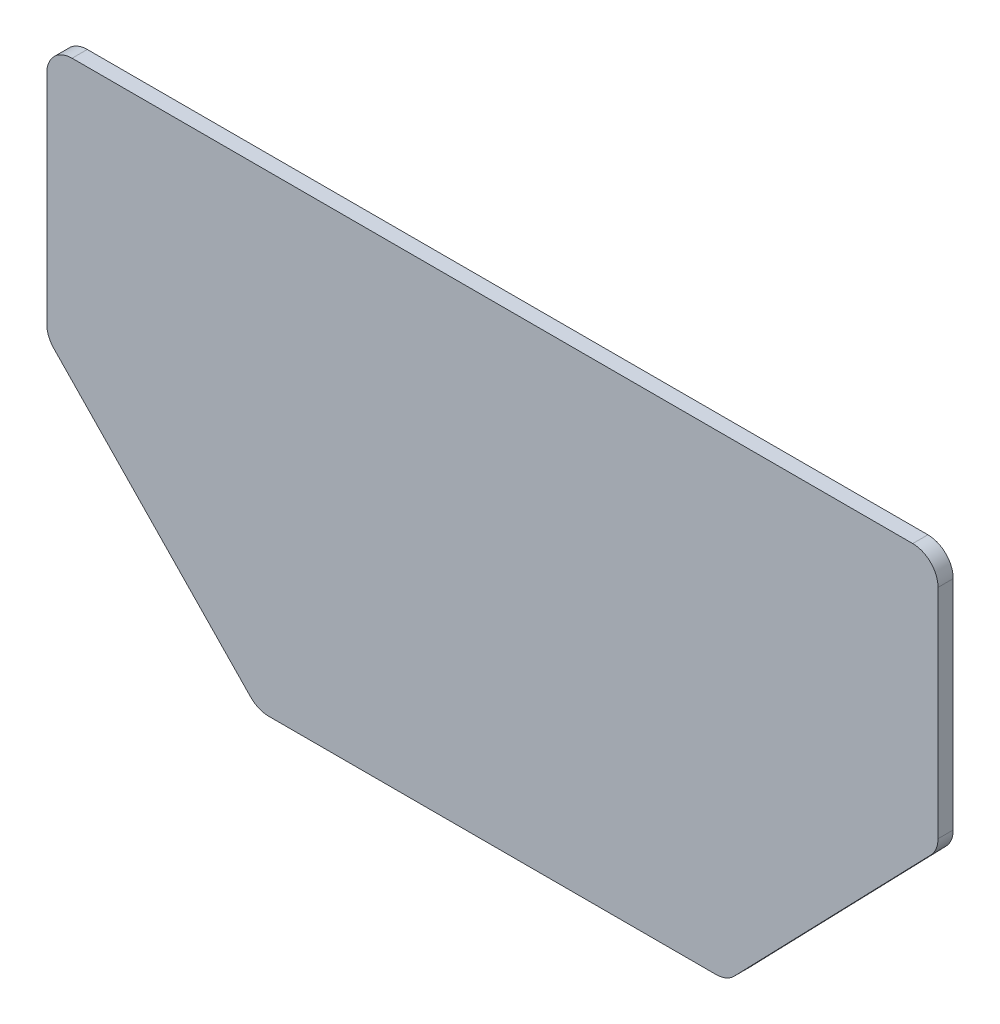
ISO-10303-21;
HEADER;
FILE_DESCRIPTION(('STEP AP214'),'2;1');
FILE_NAME('part.step','',(''),(''),'','','');
FILE_SCHEMA(('AUTOMOTIVE_DESIGN { 1 0 10303 214 1 1 1 1 }'));
ENDSEC;
DATA;
#1=APPLICATION_CONTEXT('core data for automotive mechanical design processes');
#2=APPLICATION_PROTOCOL_DEFINITION('international standard','automotive_design',2000,#1);
#3=PRODUCT_CONTEXT('',#1,'mechanical');
#4=PRODUCT('Part','Part','',(#3));
#5=PRODUCT_RELATED_PRODUCT_CATEGORY('part','',(#4));
#6=PRODUCT_DEFINITION_FORMATION('','',#4);
#7=PRODUCT_DEFINITION_CONTEXT('part definition',#1,'design');
#8=PRODUCT_DEFINITION('design','',#6,#7);
#9=PRODUCT_DEFINITION_SHAPE('','',#8);
#10=(LENGTH_UNIT() NAMED_UNIT(*) SI_UNIT(.MILLI.,.METRE.));
#11=(NAMED_UNIT(*) PLANE_ANGLE_UNIT() SI_UNIT($,.RADIAN.));
#12=(NAMED_UNIT(*) SI_UNIT($,.STERADIAN.) SOLID_ANGLE_UNIT());
#13=UNCERTAINTY_MEASURE_WITH_UNIT(LENGTH_MEASURE(1.E-05),#10,'distance_accuracy_value','');
#14=(GEOMETRIC_REPRESENTATION_CONTEXT(3) GLOBAL_UNCERTAINTY_ASSIGNED_CONTEXT((#13)) GLOBAL_UNIT_ASSIGNED_CONTEXT((#10,
#11,#12)) REPRESENTATION_CONTEXT('',''));
#15=CARTESIAN_POINT('',(0.,0.,0.));
#16=DIRECTION('',(0.,0.,1.));
#17=DIRECTION('',(1.,0.,0.));
#18=AXIS2_PLACEMENT_3D('',#15,#16,#17);
#19=CARTESIAN_POINT('',(176.,100.,6.));
#20=DIRECTION('',(0.,-1.,0.));
#21=DIRECTION('',(1.,0.,0.));
#22=AXIS2_PLACEMENT_3D('',#19,#20,#21);
#23=PLANE('',#22);
#24=DIRECTION('',(-1.,0.,0.));
#25=VECTOR('',#24,1.);
#26=CARTESIAN_POINT('',(176.,100.,6.));
#27=LINE('',#26,#25);
#28=CARTESIAN_POINT('',(166.,100.,6.));
#29=VERTEX_POINT('',#28);
#30=CARTESIAN_POINT('',(-166.,100.,6.));
#31=VERTEX_POINT('',#30);
#32=EDGE_CURVE('E172',#29,#31,#27,.T.);
#33=ORIENTED_EDGE('',*,*,#32,.F.);
#34=DIRECTION('',(0.,0.,-1.));
#35=VECTOR('',#34,1.);
#36=CARTESIAN_POINT('',(166.,100.,6.));
#37=LINE('',#36,#35);
#38=CARTESIAN_POINT('',(166.,100.,0.));
#39=VERTEX_POINT('',#38);
#40=EDGE_CURVE('E11',#29,#39,#37,.T.);
#41=ORIENTED_EDGE('',*,*,#40,.T.);
#42=DIRECTION('',(-1.,0.,0.));
#43=VECTOR('',#42,1.);
#44=CARTESIAN_POINT('',(176.,100.,0.));
#45=LINE('',#44,#43);
#46=CARTESIAN_POINT('',(-166.,100.,0.));
#47=VERTEX_POINT('',#46);
#48=EDGE_CURVE('E164',#39,#47,#45,.T.);
#49=ORIENTED_EDGE('',*,*,#48,.T.);
#50=DIRECTION('',(0.,0.,-1.));
#51=VECTOR('',#50,1.);
#52=CARTESIAN_POINT('',(-166.,100.,6.));
#53=LINE('',#52,#51);
#54=EDGE_CURVE('E49',#47,#31,#53,.F.);
#55=ORIENTED_EDGE('',*,*,#54,.T.);
#56=EDGE_LOOP('',(#33,#41,#49,#55));
#57=FACE_BOUND('',#56,.T.);
#58=ADVANCED_FACE('F41',(#57),#23,.F.);
#59=CARTESIAN_POINT('',(-176.,100.,6.));
#60=DIRECTION('',(1.,0.,0.));
#61=DIRECTION('',(0.,0.,-1.));
#62=AXIS2_PLACEMENT_3D('',#59,#60,#61);
#63=PLANE('',#62);
#64=DIRECTION('',(0.,-1.,0.));
#65=VECTOR('',#64,1.);
#66=CARTESIAN_POINT('',(-176.,100.,0.));
#67=LINE('',#66,#65);
#68=CARTESIAN_POINT('',(-176.,90.,0.));
#69=VERTEX_POINT('',#68);
#70=CARTESIAN_POINT('',(-176.,4.04512135801953,0.));
#71=VERTEX_POINT('',#70);
#72=EDGE_CURVE('E159',#69,#71,#67,.T.);
#73=ORIENTED_EDGE('',*,*,#72,.T.);
#74=DIRECTION('',(0.,0.,-1.));
#75=VECTOR('',#74,1.);
#76=CARTESIAN_POINT('',(-176.,4.04512135801953,6.));
#77=LINE('',#76,#75);
#78=CARTESIAN_POINT('',(-176.,4.04512135801953,6.));
#79=VERTEX_POINT('',#78);
#80=EDGE_CURVE('E137',#71,#79,#77,.F.);
#81=ORIENTED_EDGE('',*,*,#80,.T.);
#82=DIRECTION('',(0.,-1.,0.));
#83=VECTOR('',#82,1.);
#84=CARTESIAN_POINT('',(-176.,100.,6.));
#85=LINE('',#84,#83);
#86=CARTESIAN_POINT('',(-176.,90.,6.));
#87=VERTEX_POINT('',#86);
#88=EDGE_CURVE('E223',#87,#79,#85,.T.);
#89=ORIENTED_EDGE('',*,*,#88,.F.);
#90=DIRECTION('',(0.,0.,-1.));
#91=VECTOR('',#90,1.);
#92=CARTESIAN_POINT('',(-176.,90.,6.));
#93=LINE('',#92,#91);
#94=EDGE_CURVE('E142',#87,#69,#93,.T.);
#95=ORIENTED_EDGE('',*,*,#94,.T.);
#96=EDGE_LOOP('',(#73,#81,#89,#95));
#97=FACE_BOUND('',#96,.T.);
#98=ADVANCED_FACE('F227',(#97),#63,.F.);
#99=CARTESIAN_POINT('',(-176.,0.,6.));
#100=DIRECTION('',(0.718759299008584,0.695258994971434,0.));
#101=DIRECTION('',(-0.695258994971434,0.718759299008584,0.));
#102=AXIS2_PLACEMENT_3D('',#99,#100,#101);
#103=PLANE('',#102);
#104=DIRECTION('',(0.695258994971434,-0.718759299008584,0.));
#105=VECTOR('',#104,1.);
#106=CARTESIAN_POINT('',(-176.,0.,6.));
#107=LINE('',#106,#105);
#108=CARTESIAN_POINT('',(-173.187592990086,-2.90746859169481,6.));
#109=VERTEX_POINT('',#108);
#110=CARTESIAN_POINT('',(-95.5177729912503,-83.2025899497143,6.));
#111=VERTEX_POINT('',#110);
#112=EDGE_CURVE('E152',#109,#111,#107,.T.);
#113=ORIENTED_EDGE('',*,*,#112,.F.);
#114=DIRECTION('',(0.,0.,-1.));
#115=VECTOR('',#114,1.);
#116=CARTESIAN_POINT('',(-173.187592990086,-2.90746859169481,6.));
#117=LINE('',#116,#115);
#118=CARTESIAN_POINT('',(-173.187592990086,-2.90746859169481,0.));
#119=VERTEX_POINT('',#118);
#120=EDGE_CURVE('E136',#109,#119,#117,.T.);
#121=ORIENTED_EDGE('',*,*,#120,.T.);
#122=DIRECTION('',(0.695258994971434,-0.718759299008584,0.));
#123=VECTOR('',#122,1.);
#124=CARTESIAN_POINT('',(-176.,0.,0.));
#125=LINE('',#124,#123);
#126=CARTESIAN_POINT('',(-95.5177729912503,-83.2025899497143,0.));
#127=VERTEX_POINT('',#126);
#128=EDGE_CURVE('E149',#119,#127,#125,.T.);
#129=ORIENTED_EDGE('',*,*,#128,.T.);
#130=DIRECTION('',(0.,0.,-1.));
#131=VECTOR('',#130,1.);
#132=CARTESIAN_POINT('',(-95.5177729912503,-83.2025899497143,6.));
#133=LINE('',#132,#131);
#134=EDGE_CURVE('E154',#127,#111,#133,.F.);
#135=ORIENTED_EDGE('',*,*,#134,.T.);
#136=EDGE_LOOP('',(#113,#121,#129,#135));
#137=FACE_BOUND('',#136,.T.);
#138=ADVANCED_FACE('F148',(#137),#103,.F.);
#139=CARTESIAN_POINT('',(-92.57,-86.25,6.));
#140=DIRECTION('',(0.,1.,0.));
#141=DIRECTION('',(0.,0.,1.));
#142=AXIS2_PLACEMENT_3D('',#139,#140,#141);
#143=PLANE('',#142);
#144=DIRECTION('',(1.,0.,0.));
#145=VECTOR('',#144,1.);
#146=CARTESIAN_POINT('',(-92.57,-86.25,6.));
#147=LINE('',#146,#145);
#148=CARTESIAN_POINT('',(-88.3301800011644,-86.25,6.));
#149=VERTEX_POINT('',#148);
#150=CARTESIAN_POINT('',(88.3301800011644,-86.25,6.));
#151=VERTEX_POINT('',#150);
#152=EDGE_CURVE('E233',#149,#151,#147,.T.);
#153=ORIENTED_EDGE('',*,*,#152,.F.);
#154=DIRECTION('',(0.,0.,-1.));
#155=VECTOR('',#154,1.);
#156=CARTESIAN_POINT('',(-88.3301800011644,-86.25,6.));
#157=LINE('',#156,#155);
#158=CARTESIAN_POINT('',(-88.3301800011644,-86.25,0.));
#159=VERTEX_POINT('',#158);
#160=EDGE_CURVE('E199',#149,#159,#157,.T.);
#161=ORIENTED_EDGE('',*,*,#160,.T.);
#162=DIRECTION('',(1.,0.,0.));
#163=VECTOR('',#162,1.);
#164=CARTESIAN_POINT('',(-92.57,-86.25,0.));
#165=LINE('',#164,#163);
#166=CARTESIAN_POINT('',(88.3301800011644,-86.25,0.));
#167=VERTEX_POINT('',#166);
#168=EDGE_CURVE('E158',#159,#167,#165,.T.);
#169=ORIENTED_EDGE('',*,*,#168,.T.);
#170=DIRECTION('',(0.,0.,-1.));
#171=VECTOR('',#170,1.);
#172=CARTESIAN_POINT('',(88.3301800011644,-86.25,6.));
#173=LINE('',#172,#171);
#174=EDGE_CURVE('E197',#167,#151,#173,.F.);
#175=ORIENTED_EDGE('',*,*,#174,.T.);
#176=EDGE_LOOP('',(#153,#161,#169,#175));
#177=FACE_BOUND('',#176,.T.);
#178=ADVANCED_FACE('F243',(#177),#143,.F.);
#179=CARTESIAN_POINT('',(92.57,-86.25,6.));
#180=DIRECTION('',(-0.718759299008584,0.695258994971434,0.));
#181=DIRECTION('',(-0.695258994971434,-0.718759299008584,0.));
#182=AXIS2_PLACEMENT_3D('',#179,#180,#181);
#183=PLANE('',#182);
#184=DIRECTION('',(0.695258994971434,0.718759299008584,0.));
#185=VECTOR('',#184,1.);
#186=CARTESIAN_POINT('',(92.57,-86.25,6.));
#187=LINE('',#186,#185);
#188=CARTESIAN_POINT('',(95.5177729912503,-83.2025899497143,6.));
#189=VERTEX_POINT('',#188);
#190=CARTESIAN_POINT('',(173.187592990086,-2.90746859169483,6.));
#191=VERTEX_POINT('',#190);
#192=EDGE_CURVE('E231',#189,#191,#187,.T.);
#193=ORIENTED_EDGE('',*,*,#192,.F.);
#194=DIRECTION('',(0.,0.,-1.));
#195=VECTOR('',#194,1.);
#196=CARTESIAN_POINT('',(95.5177729912503,-83.2025899497143,6.));
#197=LINE('',#196,#195);
#198=CARTESIAN_POINT('',(95.5177729912503,-83.2025899497143,0.));
#199=VERTEX_POINT('',#198);
#200=EDGE_CURVE('E204',#189,#199,#197,.T.);
#201=ORIENTED_EDGE('',*,*,#200,.T.);
#202=DIRECTION('',(0.695258994971434,0.718759299008584,0.));
#203=VECTOR('',#202,1.);
#204=CARTESIAN_POINT('',(92.57,-86.25,0.));
#205=LINE('',#204,#203);
#206=CARTESIAN_POINT('',(173.187592990086,-2.90746859169483,0.));
#207=VERTEX_POINT('',#206);
#208=EDGE_CURVE('E162',#199,#207,#205,.T.);
#209=ORIENTED_EDGE('',*,*,#208,.T.);
#210=DIRECTION('',(0.,0.,-1.));
#211=VECTOR('',#210,1.);
#212=CARTESIAN_POINT('',(173.187592990086,-2.90746859169484,6.));
#213=LINE('',#212,#211);
#214=EDGE_CURVE('E202',#207,#191,#213,.F.);
#215=ORIENTED_EDGE('',*,*,#214,.T.);
#216=EDGE_LOOP('',(#193,#201,#209,#215));
#217=FACE_BOUND('',#216,.T.);
#218=ADVANCED_FACE('F252',(#217),#183,.F.);
#219=CARTESIAN_POINT('',(176.,0.,6.));
#220=DIRECTION('',(-1.,0.,0.));
#221=DIRECTION('',(0.,-1.,0.));
#222=AXIS2_PLACEMENT_3D('',#219,#220,#221);
#223=PLANE('',#222);
#224=DIRECTION('',(0.,1.,0.));
#225=VECTOR('',#224,1.);
#226=CARTESIAN_POINT('',(176.,0.,6.));
#227=LINE('',#226,#225);
#228=CARTESIAN_POINT('',(176.,4.04512135801952,6.));
#229=VERTEX_POINT('',#228);
#230=CARTESIAN_POINT('',(176.,90.,6.));
#231=VERTEX_POINT('',#230);
#232=EDGE_CURVE('E173',#229,#231,#227,.T.);
#233=ORIENTED_EDGE('',*,*,#232,.F.);
#234=DIRECTION('',(0.,0.,-1.));
#235=VECTOR('',#234,1.);
#236=CARTESIAN_POINT('',(176.,4.04512135801952,6.));
#237=LINE('',#236,#235);
#238=CARTESIAN_POINT('',(176.,4.04512135801952,0.));
#239=VERTEX_POINT('',#238);
#240=EDGE_CURVE('E208',#229,#239,#237,.T.);
#241=ORIENTED_EDGE('',*,*,#240,.T.);
#242=DIRECTION('',(0.,1.,0.));
#243=VECTOR('',#242,1.);
#244=CARTESIAN_POINT('',(176.,0.,0.));
#245=LINE('',#244,#243);
#246=CARTESIAN_POINT('',(176.,90.,0.));
#247=VERTEX_POINT('',#246);
#248=EDGE_CURVE('E170',#239,#247,#245,.T.);
#249=ORIENTED_EDGE('',*,*,#248,.T.);
#250=DIRECTION('',(0.,0.,-1.));
#251=VECTOR('',#250,1.);
#252=CARTESIAN_POINT('',(176.,90.,6.));
#253=LINE('',#252,#251);
#254=EDGE_CURVE('E56',#247,#231,#253,.F.);
#255=ORIENTED_EDGE('',*,*,#254,.T.);
#256=EDGE_LOOP('',(#233,#241,#249,#255));
#257=FACE_BOUND('',#256,.T.);
#258=ADVANCED_FACE('F257',(#257),#223,.F.);
#259=CARTESIAN_POINT('',(0.,0.,6.));
#260=DIRECTION('',(0.,0.,1.));
#261=DIRECTION('',(1.,0.,0.));
#262=AXIS2_PLACEMENT_3D('',#259,#260,#261);
#263=PLANE('',#262);
#264=ORIENTED_EDGE('',*,*,#88,.T.);
#265=CARTESIAN_POINT('',(-166.,4.04512135801953,6.));
#266=DIRECTION('',(0.,0.,1.));
#267=DIRECTION('',(1.,0.,0.));
#268=AXIS2_PLACEMENT_3D('',#265,#266,#267);
#269=CIRCLE('',#268,10.);
#270=EDGE_CURVE('E195',#79,#109,#269,.T.);
#271=ORIENTED_EDGE('',*,*,#270,.T.);
#272=ORIENTED_EDGE('',*,*,#112,.T.);
#273=CARTESIAN_POINT('',(-88.3301800011644,-76.25,6.));
#274=DIRECTION('',(0.,0.,1.));
#275=DIRECTION('',(1.,0.,0.));
#276=AXIS2_PLACEMENT_3D('',#273,#274,#275);
#277=CIRCLE('',#276,10.);
#278=EDGE_CURVE('E193',#111,#149,#277,.T.);
#279=ORIENTED_EDGE('',*,*,#278,.T.);
#280=ORIENTED_EDGE('',*,*,#152,.T.);
#281=CARTESIAN_POINT('',(88.3301800011644,-76.25,6.));
#282=DIRECTION('',(0.,0.,1.));
#283=DIRECTION('',(1.,0.,0.));
#284=AXIS2_PLACEMENT_3D('',#281,#282,#283);
#285=CIRCLE('',#284,10.);
#286=EDGE_CURVE('E191',#151,#189,#285,.T.);
#287=ORIENTED_EDGE('',*,*,#286,.T.);
#288=ORIENTED_EDGE('',*,*,#192,.T.);
#289=CARTESIAN_POINT('',(166.,4.04512135801951,6.));
#290=DIRECTION('',(0.,0.,1.));
#291=DIRECTION('',(1.,0.,0.));
#292=AXIS2_PLACEMENT_3D('',#289,#290,#291);
#293=CIRCLE('',#292,10.);
#294=EDGE_CURVE('E63',#191,#229,#293,.T.);
#295=ORIENTED_EDGE('',*,*,#294,.T.);
#296=ORIENTED_EDGE('',*,*,#232,.T.);
#297=CARTESIAN_POINT('',(166.,90.,6.));
#298=DIRECTION('',(0.,0.,1.));
#299=DIRECTION('',(1.,0.,0.));
#300=AXIS2_PLACEMENT_3D('',#297,#298,#299);
#301=CIRCLE('',#300,10.);
#302=EDGE_CURVE('E188',#231,#29,#301,.T.);
#303=ORIENTED_EDGE('',*,*,#302,.T.);
#304=ORIENTED_EDGE('',*,*,#32,.T.);
#305=CARTESIAN_POINT('',(-166.,90.,6.));
#306=DIRECTION('',(0.,0.,1.));
#307=DIRECTION('',(1.,0.,0.));
#308=AXIS2_PLACEMENT_3D('',#305,#306,#307);
#309=CIRCLE('',#308,10.);
#310=EDGE_CURVE('E186',#31,#87,#309,.T.);
#311=ORIENTED_EDGE('',*,*,#310,.T.);
#312=EDGE_LOOP('',(#264,#271,#272,#279,#280,#287,#288,#295,#296,#303,#304,#311));
#313=FACE_BOUND('',#312,.T.);
#314=ADVANCED_FACE('F220',(#313),#263,.T.);
#315=CARTESIAN_POINT('',(0.,0.,0.));
#316=DIRECTION('',(0.,0.,1.));
#317=DIRECTION('',(1.,0.,0.));
#318=AXIS2_PLACEMENT_3D('',#315,#316,#317);
#319=PLANE('',#318);
#320=ORIENTED_EDGE('',*,*,#128,.F.);
#321=CARTESIAN_POINT('',(-166.,4.04512135801953,0.));
#322=DIRECTION('',(0.,0.,1.));
#323=DIRECTION('',(1.,0.,0.));
#324=AXIS2_PLACEMENT_3D('',#321,#322,#323);
#325=CIRCLE('',#324,10.);
#326=EDGE_CURVE('E132',#119,#71,#325,.F.);
#327=ORIENTED_EDGE('',*,*,#326,.T.);
#328=ORIENTED_EDGE('',*,*,#72,.F.);
#329=CARTESIAN_POINT('',(-166.,90.,0.));
#330=DIRECTION('',(0.,0.,1.));
#331=DIRECTION('',(1.,0.,0.));
#332=AXIS2_PLACEMENT_3D('',#329,#330,#331);
#333=CIRCLE('',#332,10.);
#334=EDGE_CURVE('E153',#69,#47,#333,.F.);
#335=ORIENTED_EDGE('',*,*,#334,.T.);
#336=ORIENTED_EDGE('',*,*,#48,.F.);
#337=CARTESIAN_POINT('',(166.,90.,0.));
#338=DIRECTION('',(0.,0.,1.));
#339=DIRECTION('',(1.,0.,0.));
#340=AXIS2_PLACEMENT_3D('',#337,#338,#339);
#341=CIRCLE('',#340,10.);
#342=EDGE_CURVE('E176',#39,#247,#341,.F.);
#343=ORIENTED_EDGE('',*,*,#342,.T.);
#344=ORIENTED_EDGE('',*,*,#248,.F.);
#345=CARTESIAN_POINT('',(166.,4.04512135801951,0.));
#346=DIRECTION('',(0.,0.,1.));
#347=DIRECTION('',(1.,0.,0.));
#348=AXIS2_PLACEMENT_3D('',#345,#346,#347);
#349=CIRCLE('',#348,10.);
#350=EDGE_CURVE('E178',#239,#207,#349,.F.);
#351=ORIENTED_EDGE('',*,*,#350,.T.);
#352=ORIENTED_EDGE('',*,*,#208,.F.);
#353=CARTESIAN_POINT('',(88.3301800011644,-76.25,0.));
#354=DIRECTION('',(0.,0.,1.));
#355=DIRECTION('',(1.,0.,0.));
#356=AXIS2_PLACEMENT_3D('',#353,#354,#355);
#357=CIRCLE('',#356,10.);
#358=EDGE_CURVE('E180',#199,#167,#357,.F.);
#359=ORIENTED_EDGE('',*,*,#358,.T.);
#360=ORIENTED_EDGE('',*,*,#168,.F.);
#361=CARTESIAN_POINT('',(-88.3301800011644,-76.25,0.));
#362=DIRECTION('',(0.,0.,1.));
#363=DIRECTION('',(1.,0.,0.));
#364=AXIS2_PLACEMENT_3D('',#361,#362,#363);
#365=CIRCLE('',#364,10.);
#366=EDGE_CURVE('E143',#159,#127,#365,.F.);
#367=ORIENTED_EDGE('',*,*,#366,.T.);
#368=EDGE_LOOP('',(#320,#327,#328,#335,#336,#343,#344,#351,#352,#359,#360,#367));
#369=FACE_BOUND('',#368,.T.);
#370=ADVANCED_FACE('F156',(#369),#319,.F.);
#371=CARTESIAN_POINT('',(-166.,4.04512135801953,6.));
#372=DIRECTION('',(0.,0.,-1.));
#373=DIRECTION('',(-1.,0.,0.));
#374=AXIS2_PLACEMENT_3D('',#371,#372,#373);
#375=CYLINDRICAL_SURFACE('',#374,10.);
#376=ORIENTED_EDGE('',*,*,#270,.F.);
#377=ORIENTED_EDGE('',*,*,#80,.F.);
#378=ORIENTED_EDGE('',*,*,#326,.F.);
#379=ORIENTED_EDGE('',*,*,#120,.F.);
#380=EDGE_LOOP('',(#376,#377,#378,#379));
#381=FACE_BOUND('',#380,.T.);
#382=ADVANCED_FACE('F135',(#381),#375,.T.);
#383=CARTESIAN_POINT('',(-88.3301800011644,-76.25,6.));
#384=DIRECTION('',(0.,0.,-1.));
#385=DIRECTION('',(-1.,0.,0.));
#386=AXIS2_PLACEMENT_3D('',#383,#384,#385);
#387=CYLINDRICAL_SURFACE('',#386,10.);
#388=ORIENTED_EDGE('',*,*,#278,.F.);
#389=ORIENTED_EDGE('',*,*,#134,.F.);
#390=ORIENTED_EDGE('',*,*,#366,.F.);
#391=ORIENTED_EDGE('',*,*,#160,.F.);
#392=EDGE_LOOP('',(#388,#389,#390,#391));
#393=FACE_BOUND('',#392,.T.);
#394=ADVANCED_FACE('F241',(#393),#387,.T.);
#395=CARTESIAN_POINT('',(88.3301800011644,-76.25,6.));
#396=DIRECTION('',(0.,0.,-1.));
#397=DIRECTION('',(-1.,0.,0.));
#398=AXIS2_PLACEMENT_3D('',#395,#396,#397);
#399=CYLINDRICAL_SURFACE('',#398,10.);
#400=ORIENTED_EDGE('',*,*,#286,.F.);
#401=ORIENTED_EDGE('',*,*,#174,.F.);
#402=ORIENTED_EDGE('',*,*,#358,.F.);
#403=ORIENTED_EDGE('',*,*,#200,.F.);
#404=EDGE_LOOP('',(#400,#401,#402,#403));
#405=FACE_BOUND('',#404,.T.);
#406=ADVANCED_FACE('F249',(#405),#399,.T.);
#407=CARTESIAN_POINT('',(166.,4.04512135801951,6.));
#408=DIRECTION('',(0.,0.,-1.));
#409=DIRECTION('',(-1.,0.,0.));
#410=AXIS2_PLACEMENT_3D('',#407,#408,#409);
#411=CYLINDRICAL_SURFACE('',#410,10.);
#412=ORIENTED_EDGE('',*,*,#294,.F.);
#413=ORIENTED_EDGE('',*,*,#214,.F.);
#414=ORIENTED_EDGE('',*,*,#350,.F.);
#415=ORIENTED_EDGE('',*,*,#240,.F.);
#416=EDGE_LOOP('',(#412,#413,#414,#415));
#417=FACE_BOUND('',#416,.T.);
#418=ADVANCED_FACE('F256',(#417),#411,.T.);
#419=CARTESIAN_POINT('',(166.,90.,6.));
#420=DIRECTION('',(0.,0.,-1.));
#421=DIRECTION('',(-1.,0.,0.));
#422=AXIS2_PLACEMENT_3D('',#419,#420,#421);
#423=CYLINDRICAL_SURFACE('',#422,10.);
#424=ORIENTED_EDGE('',*,*,#302,.F.);
#425=ORIENTED_EDGE('',*,*,#254,.F.);
#426=ORIENTED_EDGE('',*,*,#342,.F.);
#427=ORIENTED_EDGE('',*,*,#40,.F.);
#428=EDGE_LOOP('',(#424,#425,#426,#427));
#429=FACE_BOUND('',#428,.T.);
#430=ADVANCED_FACE('F259',(#429),#423,.T.);
#431=CARTESIAN_POINT('',(-166.,90.,6.));
#432=DIRECTION('',(0.,0.,-1.));
#433=DIRECTION('',(-1.,0.,0.));
#434=AXIS2_PLACEMENT_3D('',#431,#432,#433);
#435=CYLINDRICAL_SURFACE('',#434,10.);
#436=ORIENTED_EDGE('',*,*,#310,.F.);
#437=ORIENTED_EDGE('',*,*,#54,.F.);
#438=ORIENTED_EDGE('',*,*,#334,.F.);
#439=ORIENTED_EDGE('',*,*,#94,.F.);
#440=EDGE_LOOP('',(#436,#437,#438,#439));
#441=FACE_BOUND('',#440,.T.);
#442=ADVANCED_FACE('F43',(#441),#435,.T.);
#443=CLOSED_SHELL('',(#58,#98,#138,#178,#218,#258,#314,#370,#382,#394,#406,#418,#430,#442));
#444=MANIFOLD_SOLID_BREP('B2',#443);
#445=ADVANCED_BREP_SHAPE_REPRESENTATION('',(#18,#444),#14);
#446=SHAPE_DEFINITION_REPRESENTATION(#9,#445);
ENDSEC;
END-ISO-10303-21;
